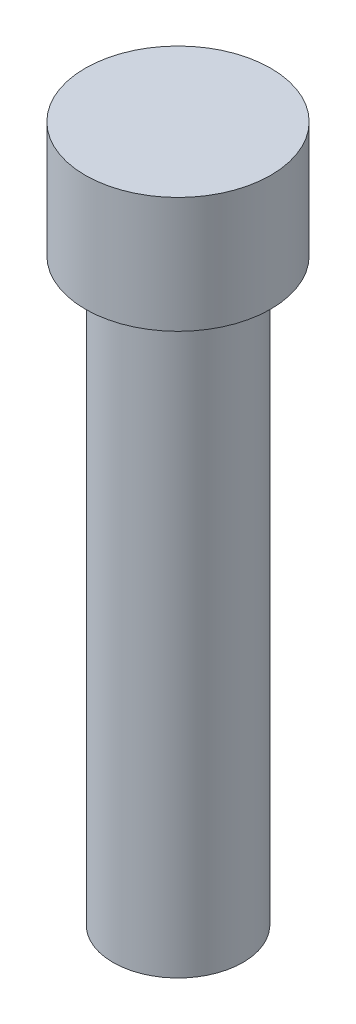
ISO-10303-21;
HEADER;
FILE_DESCRIPTION(('STEP AP214'),'2;1');
FILE_NAME('part.step','',(''),(''),'','','');
FILE_SCHEMA(('AUTOMOTIVE_DESIGN { 1 0 10303 214 1 1 1 1 }'));
ENDSEC;
DATA;
#1=APPLICATION_CONTEXT('core data for automotive mechanical design processes');
#2=APPLICATION_PROTOCOL_DEFINITION('international standard','automotive_design',2000,#1);
#3=PRODUCT_CONTEXT('',#1,'mechanical');
#4=PRODUCT('Part','Part','',(#3));
#5=PRODUCT_RELATED_PRODUCT_CATEGORY('part','',(#4));
#6=PRODUCT_DEFINITION_FORMATION('','',#4);
#7=PRODUCT_DEFINITION_CONTEXT('part definition',#1,'design');
#8=PRODUCT_DEFINITION('design','',#6,#7);
#9=PRODUCT_DEFINITION_SHAPE('','',#8);
#10=(LENGTH_UNIT() NAMED_UNIT(*) SI_UNIT(.MILLI.,.METRE.));
#11=(NAMED_UNIT(*) PLANE_ANGLE_UNIT() SI_UNIT($,.RADIAN.));
#12=(NAMED_UNIT(*) SI_UNIT($,.STERADIAN.) SOLID_ANGLE_UNIT());
#13=UNCERTAINTY_MEASURE_WITH_UNIT(LENGTH_MEASURE(1.E-05),#10,'distance_accuracy_value','');
#14=(GEOMETRIC_REPRESENTATION_CONTEXT(3) GLOBAL_UNCERTAINTY_ASSIGNED_CONTEXT((#13)) GLOBAL_UNIT_ASSIGNED_CONTEXT((#10,
#11,#12)) REPRESENTATION_CONTEXT('',''));
#15=CARTESIAN_POINT('',(0.,0.,0.));
#16=DIRECTION('',(0.,0.,1.));
#17=DIRECTION('',(1.,0.,0.));
#18=AXIS2_PLACEMENT_3D('',#15,#16,#17);
#19=CARTESIAN_POINT('',(0.,25.,0.));
#20=DIRECTION('',(0.,-1.,0.));
#21=DIRECTION('',(0.,0.,-1.));
#22=AXIS2_PLACEMENT_3D('',#19,#20,#21);
#23=CYLINDRICAL_SURFACE('',#22,2.8);
#24=CARTESIAN_POINT('',(0.,25.,0.));
#25=DIRECTION('',(0.,1.,0.));
#26=DIRECTION('',(0.,0.,1.));
#27=AXIS2_PLACEMENT_3D('',#24,#25,#26);
#28=CIRCLE('',#27,2.8);
#29=CARTESIAN_POINT('',(0.,25.,2.8));
#30=VERTEX_POINT('',#29);
#31=EDGE_CURVE('E10',#30,#30,#28,.T.);
#32=ORIENTED_EDGE('',*,*,#31,.F.);
#33=EDGE_LOOP('',(#32));
#34=FACE_BOUND('',#33,.T.);
#35=CARTESIAN_POINT('',(0.,0.,0.));
#36=DIRECTION('',(0.,1.,0.));
#37=DIRECTION('',(0.,0.,1.));
#38=AXIS2_PLACEMENT_3D('',#35,#36,#37);
#39=CIRCLE('',#38,2.8);
#40=CARTESIAN_POINT('',(0.,0.,2.8));
#41=VERTEX_POINT('',#40);
#42=EDGE_CURVE('E46',#41,#41,#39,.T.);
#43=ORIENTED_EDGE('',*,*,#42,.T.);
#44=EDGE_LOOP('',(#43));
#45=FACE_BOUND('',#44,.T.);
#46=ADVANCED_FACE('F43',(#34,#45),#23,.T.);
#47=CARTESIAN_POINT('',(0.,0.,0.));
#48=DIRECTION('',(0.,1.,0.));
#49=DIRECTION('',(0.,0.,1.));
#50=AXIS2_PLACEMENT_3D('',#47,#48,#49);
#51=PLANE('',#50);
#52=ORIENTED_EDGE('',*,*,#42,.F.);
#53=EDGE_LOOP('',(#52));
#54=FACE_BOUND('',#53,.T.);
#55=ADVANCED_FACE('F70',(#54),#51,.F.);
#56=CARTESIAN_POINT('',(0.,30.,0.));
#57=DIRECTION('',(0.,-1.,0.));
#58=DIRECTION('',(0.,0.,-1.));
#59=AXIS2_PLACEMENT_3D('',#56,#57,#58);
#60=CYLINDRICAL_SURFACE('',#59,4.);
#61=CARTESIAN_POINT('',(0.,30.,0.));
#62=DIRECTION('',(0.,1.,0.));
#63=DIRECTION('',(0.,0.,1.));
#64=AXIS2_PLACEMENT_3D('',#61,#62,#63);
#65=CIRCLE('',#64,4.);
#66=CARTESIAN_POINT('',(0.,30.,4.));
#67=VERTEX_POINT('',#66);
#68=EDGE_CURVE('E55',#67,#67,#65,.T.);
#69=ORIENTED_EDGE('',*,*,#68,.F.);
#70=EDGE_LOOP('',(#69));
#71=FACE_BOUND('',#70,.T.);
#72=CARTESIAN_POINT('',(0.,25.,0.));
#73=DIRECTION('',(0.,1.,0.));
#74=DIRECTION('',(0.,0.,1.));
#75=AXIS2_PLACEMENT_3D('',#72,#73,#74);
#76=CIRCLE('',#75,4.);
#77=CARTESIAN_POINT('',(0.,25.,4.));
#78=VERTEX_POINT('',#77);
#79=EDGE_CURVE('E57',#78,#78,#76,.T.);
#80=ORIENTED_EDGE('',*,*,#79,.T.);
#81=EDGE_LOOP('',(#80));
#82=FACE_BOUND('',#81,.T.);
#83=ADVANCED_FACE('F67',(#71,#82),#60,.T.);
#84=CARTESIAN_POINT('',(0.,30.,0.));
#85=DIRECTION('',(0.,1.,0.));
#86=DIRECTION('',(0.,0.,1.));
#87=AXIS2_PLACEMENT_3D('',#84,#85,#86);
#88=PLANE('',#87);
#89=ORIENTED_EDGE('',*,*,#68,.T.);
#90=EDGE_LOOP('',(#89));
#91=FACE_BOUND('',#90,.T.);
#92=ADVANCED_FACE('F65',(#91),#88,.T.);
#93=CARTESIAN_POINT('',(0.,25.,0.));
#94=DIRECTION('',(0.,1.,0.));
#95=DIRECTION('',(0.,0.,1.));
#96=AXIS2_PLACEMENT_3D('',#93,#94,#95);
#97=PLANE('',#96);
#98=ORIENTED_EDGE('',*,*,#31,.T.);
#99=EDGE_LOOP('',(#98));
#100=FACE_BOUND('',#99,.T.);
#101=ORIENTED_EDGE('',*,*,#79,.F.);
#102=EDGE_LOOP('',(#101));
#103=FACE_BOUND('',#102,.T.);
#104=ADVANCED_FACE('F74',(#100,#103),#97,.F.);
#105=CLOSED_SHELL('',(#46,#55,#83,#92,#104));
#106=MANIFOLD_SOLID_BREP('B2',#105);
#107=ADVANCED_BREP_SHAPE_REPRESENTATION('',(#18,#106),#14);
#108=SHAPE_DEFINITION_REPRESENTATION(#9,#107);
ENDSEC;
END-ISO-10303-21;
